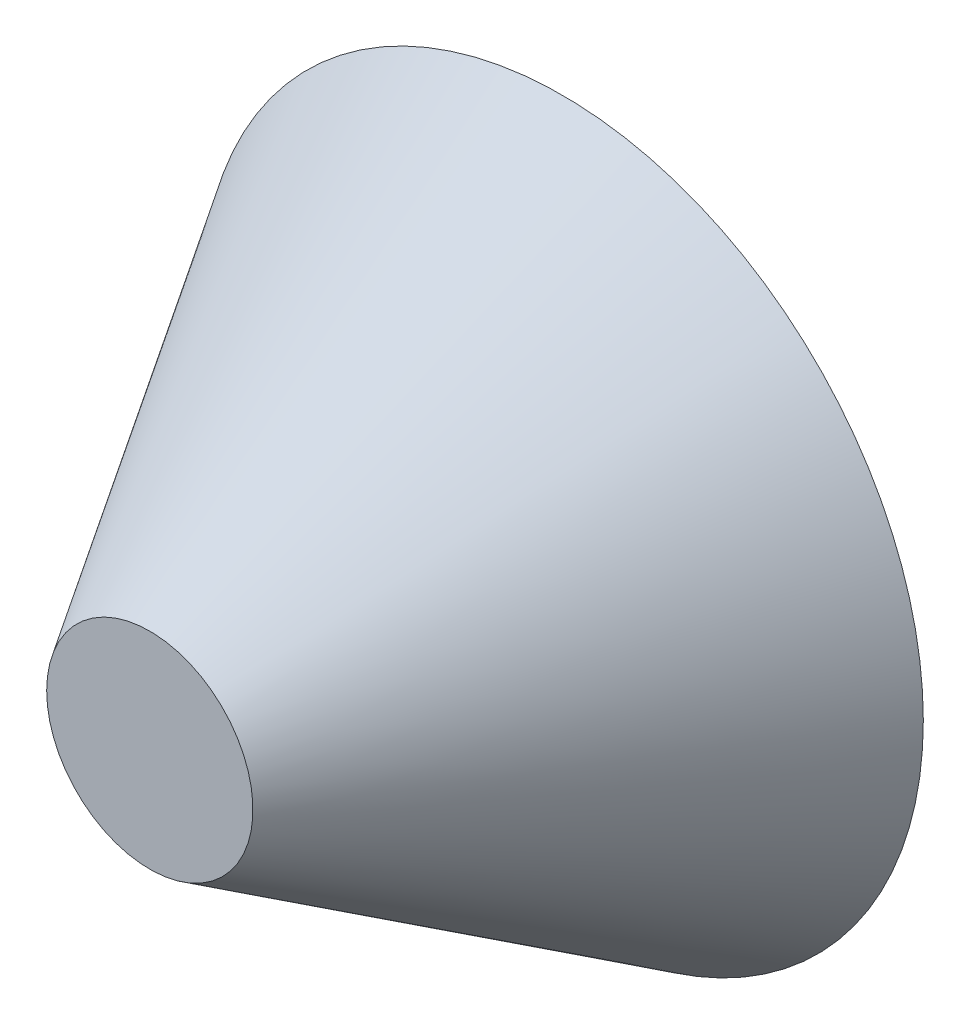
ISO-10303-21;
HEADER;
FILE_DESCRIPTION(('STEP AP214'),'2;1');
FILE_NAME('part.step','',(''),(''),'','','');
FILE_SCHEMA(('AUTOMOTIVE_DESIGN { 1 0 10303 214 1 1 1 1 }'));
ENDSEC;
DATA;
#1=APPLICATION_CONTEXT('core data for automotive mechanical design processes');
#2=APPLICATION_PROTOCOL_DEFINITION('international standard','automotive_design',2000,#1);
#3=PRODUCT_CONTEXT('',#1,'mechanical');
#4=PRODUCT('Part','Part','',(#3));
#5=PRODUCT_RELATED_PRODUCT_CATEGORY('part','',(#4));
#6=PRODUCT_DEFINITION_FORMATION('','',#4);
#7=PRODUCT_DEFINITION_CONTEXT('part definition',#1,'design');
#8=PRODUCT_DEFINITION('design','',#6,#7);
#9=PRODUCT_DEFINITION_SHAPE('','',#8);
#10=(LENGTH_UNIT() NAMED_UNIT(*) SI_UNIT(.MILLI.,.METRE.));
#11=(NAMED_UNIT(*) PLANE_ANGLE_UNIT() SI_UNIT($,.RADIAN.));
#12=(NAMED_UNIT(*) SI_UNIT($,.STERADIAN.) SOLID_ANGLE_UNIT());
#13=UNCERTAINTY_MEASURE_WITH_UNIT(LENGTH_MEASURE(1.E-05),#10,'distance_accuracy_value','');
#14=(GEOMETRIC_REPRESENTATION_CONTEXT(3) GLOBAL_UNCERTAINTY_ASSIGNED_CONTEXT((#13)) GLOBAL_UNIT_ASSIGNED_CONTEXT((#10,
#11,#12)) REPRESENTATION_CONTEXT('',''));
#15=CARTESIAN_POINT('',(0.,0.,0.));
#16=DIRECTION('',(0.,0.,1.));
#17=DIRECTION('',(1.,0.,0.));
#18=AXIS2_PLACEMENT_3D('',#15,#16,#17);
#19=CARTESIAN_POINT('',(0.,0.,508.));
#20=DIRECTION('',(0.,0.,1.));
#21=DIRECTION('',(1.,0.,0.));
#22=AXIS2_PLACEMENT_3D('',#19,#20,#21);
#23=PLANE('',#22);
#24=CARTESIAN_POINT('',(0.,0.,508.));
#25=DIRECTION('',(0.,0.,1.));
#26=DIRECTION('',(1.,0.,0.));
#27=AXIS2_PLACEMENT_3D('',#24,#25,#26);
#28=CIRCLE('',#27,127.);
#29=CARTESIAN_POINT('',(-127.,0.,508.));
#30=VERTEX_POINT('',#29);
#31=EDGE_CURVE('E11',#30,#30,#28,.T.);
#32=ORIENTED_EDGE('',*,*,#31,.T.);
#33=EDGE_LOOP('',(#32));
#34=FACE_BOUND('',#33,.T.);
#35=ADVANCED_FACE('F32',(#34),#23,.T.);
#36=CARTESIAN_POINT('',(0.,0.,0.));
#37=DIRECTION('',(0.,0.,1.));
#38=DIRECTION('',(1.,0.,0.));
#39=AXIS2_PLACEMENT_3D('',#36,#37,#38);
#40=PLANE('',#39);
#41=CARTESIAN_POINT('',(0.,0.,0.));
#42=DIRECTION('',(0.,0.,1.));
#43=DIRECTION('',(1.,0.,0.));
#44=AXIS2_PLACEMENT_3D('',#41,#42,#43);
#45=CIRCLE('',#44,444.5);
#46=CARTESIAN_POINT('',(-444.5,0.,0.));
#47=VERTEX_POINT('',#46);
#48=EDGE_CURVE('E40',#47,#47,#45,.T.);
#49=ORIENTED_EDGE('',*,*,#48,.F.);
#50=EDGE_LOOP('',(#49));
#51=FACE_BOUND('',#50,.T.);
#52=ADVANCED_FACE('F63',(#51),#40,.F.);
#53=CARTESIAN_POINT('',(0.,0.,508.));
#54=DIRECTION('',(0.,0.,-1.));
#55=DIRECTION('',(-1.,0.,0.));
#56=AXIS2_PLACEMENT_3D('',#53,#54,#55);
#57=CONICAL_SURFACE('',#56,127.,0.558599315343562);
#58=CARTESIAN_POINT('',(-444.5,0.,0.));
#59=CARTESIAN_POINT('',(-441.192708333333,0.,5.29166666666666));
#60=CARTESIAN_POINT('',(-437.885416666667,0.,10.5833333333333));
#61=CARTESIAN_POINT('',(-431.270833333333,0.,21.1666666666667));
#62=CARTESIAN_POINT('',(-427.963541666667,0.,26.4583333333333));
#63=CARTESIAN_POINT('',(-421.348958333333,0.,37.0416666666667));
#64=CARTESIAN_POINT('',(-418.041666666667,0.,42.3333333333333));
#65=CARTESIAN_POINT('',(-411.427083333333,0.,52.9166666666667));
#66=CARTESIAN_POINT('',(-408.119791666667,0.,58.2083333333333));
#67=CARTESIAN_POINT('',(-401.505208333333,0.,68.7916666666667));
#68=CARTESIAN_POINT('',(-398.197916666667,0.,74.0833333333333));
#69=CARTESIAN_POINT('',(-391.583333333333,0.,84.6666666666667));
#70=CARTESIAN_POINT('',(-388.276041666667,0.,89.9583333333333));
#71=CARTESIAN_POINT('',(-381.661458333333,0.,100.541666666667));
#72=CARTESIAN_POINT('',(-378.354166666667,0.,105.833333333333));
#73=CARTESIAN_POINT('',(-371.739583333333,0.,116.416666666667));
#74=CARTESIAN_POINT('',(-368.432291666667,0.,121.708333333333));
#75=CARTESIAN_POINT('',(-361.817708333333,0.,132.291666666667));
#76=CARTESIAN_POINT('',(-358.510416666667,0.,137.583333333333));
#77=CARTESIAN_POINT('',(-351.895833333333,0.,148.166666666667));
#78=CARTESIAN_POINT('',(-348.588541666667,0.,153.458333333333));
#79=CARTESIAN_POINT('',(-341.973958333333,0.,164.041666666667));
#80=CARTESIAN_POINT('',(-338.666666666667,0.,169.333333333333));
#81=CARTESIAN_POINT('',(-332.052083333333,0.,179.916666666667));
#82=CARTESIAN_POINT('',(-328.744791666667,0.,185.208333333333));
#83=CARTESIAN_POINT('',(-322.130208333333,0.,195.791666666667));
#84=CARTESIAN_POINT('',(-318.822916666667,0.,201.083333333333));
#85=CARTESIAN_POINT('',(-312.208333333333,0.,211.666666666667));
#86=CARTESIAN_POINT('',(-308.901041666667,0.,216.958333333333));
#87=CARTESIAN_POINT('',(-302.286458333333,0.,227.541666666667));
#88=CARTESIAN_POINT('',(-298.979166666667,0.,232.833333333333));
#89=CARTESIAN_POINT('',(-292.364583333333,0.,243.416666666667));
#90=CARTESIAN_POINT('',(-289.057291666667,0.,248.708333333333));
#91=CARTESIAN_POINT('',(-282.442708333333,0.,259.291666666667));
#92=CARTESIAN_POINT('',(-279.135416666667,0.,264.583333333333));
#93=CARTESIAN_POINT('',(-272.520833333333,0.,275.166666666667));
#94=CARTESIAN_POINT('',(-269.213541666667,0.,280.458333333333));
#95=CARTESIAN_POINT('',(-262.598958333333,0.,291.041666666667));
#96=CARTESIAN_POINT('',(-259.291666666667,0.,296.333333333333));
#97=CARTESIAN_POINT('',(-252.677083333333,0.,306.916666666667));
#98=CARTESIAN_POINT('',(-249.369791666667,0.,312.208333333333));
#99=CARTESIAN_POINT('',(-242.755208333333,0.,322.791666666667));
#100=CARTESIAN_POINT('',(-239.447916666667,0.,328.083333333333));
#101=CARTESIAN_POINT('',(-232.833333333333,0.,338.666666666667));
#102=CARTESIAN_POINT('',(-229.526041666667,0.,343.958333333333));
#103=CARTESIAN_POINT('',(-222.911458333333,0.,354.541666666667));
#104=CARTESIAN_POINT('',(-219.604166666667,0.,359.833333333333));
#105=CARTESIAN_POINT('',(-212.989583333333,0.,370.416666666667));
#106=CARTESIAN_POINT('',(-209.682291666667,0.,375.708333333333));
#107=CARTESIAN_POINT('',(-203.067708333333,0.,386.291666666667));
#108=CARTESIAN_POINT('',(-199.760416666667,0.,391.583333333333));
#109=CARTESIAN_POINT('',(-193.145833333333,0.,402.166666666667));
#110=CARTESIAN_POINT('',(-189.838541666667,0.,407.458333333333));
#111=CARTESIAN_POINT('',(-183.223958333333,0.,418.041666666667));
#112=CARTESIAN_POINT('',(-179.916666666667,0.,423.333333333333));
#113=CARTESIAN_POINT('',(-173.302083333333,0.,433.916666666667));
#114=CARTESIAN_POINT('',(-169.994791666667,0.,439.208333333333));
#115=CARTESIAN_POINT('',(-163.380208333333,0.,449.791666666667));
#116=CARTESIAN_POINT('',(-160.072916666667,0.,455.083333333333));
#117=CARTESIAN_POINT('',(-153.458333333333,0.,465.666666666667));
#118=CARTESIAN_POINT('',(-150.151041666667,0.,470.958333333333));
#119=CARTESIAN_POINT('',(-143.536458333333,0.,481.541666666667));
#120=CARTESIAN_POINT('',(-140.229166666667,0.,486.833333333333));
#121=CARTESIAN_POINT('',(-133.614583333333,0.,497.416666666667));
#122=CARTESIAN_POINT('',(-130.307291666667,0.,502.708333333333));
#123=CARTESIAN_POINT('',(-127.,0.,508.));
#124=B_SPLINE_CURVE_WITH_KNOTS('',3,(#58,#59,#60,#61,#62,#63,#64,#65,#66,#67,#68,#69,#70,#71,
#72,#73,#74,#75,#76,#77,#78,#79,#80,#81,#82,#83,#84,#85,#86,#87,#88,#89,#90,#91,#92,#93,#94,#95,
#96,#97,#98,#99,#100,#101,#102,#103,#104,#105,#106,#107,#108,#109,#110,#111,#112,#113,#114,#115,
#116,#117,#118,#119,#120,#121,#122,#123),.UNSPECIFIED.,.F.,.F.,(4,2,2,2,2,2,2,2,2,2,2,2,2,2,2,2,
2,2,2,2,2,2,2,2,2,2,2,2,2,2,2,2,4),(0.,18.7205563089248,37.4411126178496,56.1616689267745,
74.8822252356993,93.6027815446241,112.323337853549,131.043894162474,149.764450471399,
168.485006780323,187.205563089248,205.926119398173,224.646675707098,243.367232016023,
262.087788324947,280.808344633872,299.528900942797,318.249457251722,336.970013560647,
355.690569869572,374.411126178496,393.131682487421,411.852238796346,430.572795105271,
449.293351414196,468.01390772312,486.734464032045,505.45502034097,524.175576649895,
542.89613295882,561.616689267745,580.33724557667,599.057801885594),.UNSPECIFIED.);
#125=EDGE_CURVE('BSEAM71',#47,#30,#124,.T.);
#126=ORIENTED_EDGE('',*,*,#48,.T.);
#127=ORIENTED_EDGE('',*,*,#31,.F.);
#128=ORIENTED_EDGE('',*,*,#125,.T.);
#129=ORIENTED_EDGE('',*,*,#125,.F.);
#130=EDGE_LOOP('',(#126,#128,#127,#129));
#131=FACE_BOUND('',#130,.T.);
#132=ADVANCED_FACE('F71',(#131),#57,.T.);
#133=CLOSED_SHELL('',(#35,#52,#132));
#134=MANIFOLD_SOLID_BREP('B2',#133);
#135=ADVANCED_BREP_SHAPE_REPRESENTATION('',(#18,#134),#14);
#136=SHAPE_DEFINITION_REPRESENTATION(#9,#135);
ENDSEC;
END-ISO-10303-21;
